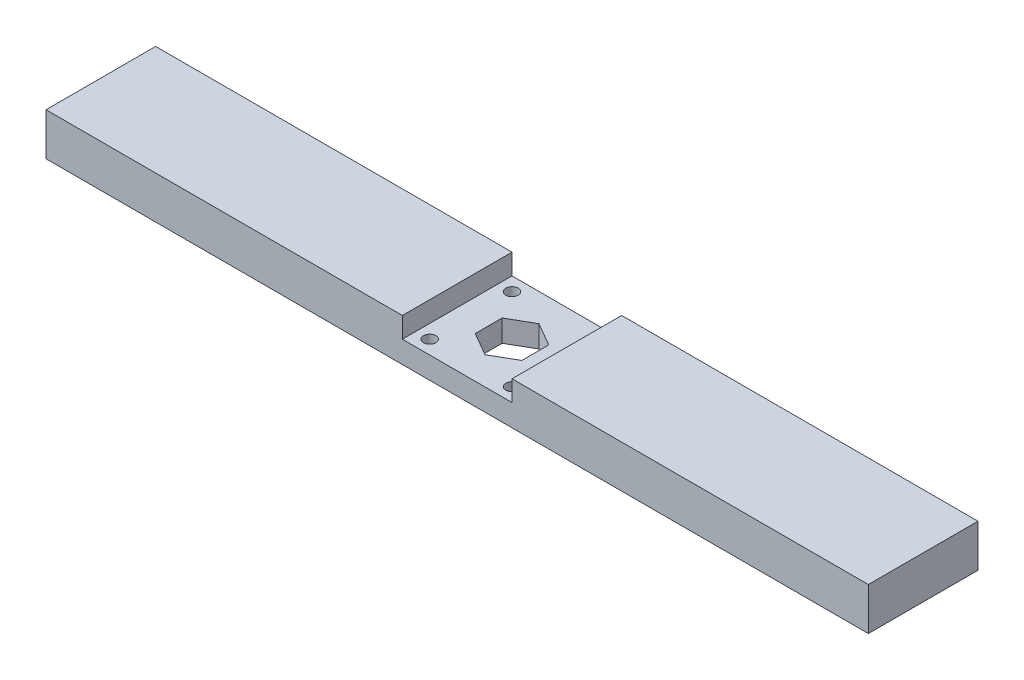
ISO-10303-21;
HEADER;
FILE_DESCRIPTION(('STEP AP214'),'2;1');
FILE_NAME('part.step','',(''),(''),'','','');
FILE_SCHEMA(('AUTOMOTIVE_DESIGN { 1 0 10303 214 1 1 1 1 }'));
ENDSEC;
DATA;
#1=APPLICATION_CONTEXT('core data for automotive mechanical design processes');
#2=APPLICATION_PROTOCOL_DEFINITION('international standard','automotive_design',2000,#1);
#3=PRODUCT_CONTEXT('',#1,'mechanical');
#4=PRODUCT('Part','Part','',(#3));
#5=PRODUCT_RELATED_PRODUCT_CATEGORY('part','',(#4));
#6=PRODUCT_DEFINITION_FORMATION('','',#4);
#7=PRODUCT_DEFINITION_CONTEXT('part definition',#1,'design');
#8=PRODUCT_DEFINITION('design','',#6,#7);
#9=PRODUCT_DEFINITION_SHAPE('','',#8);
#10=(LENGTH_UNIT() NAMED_UNIT(*) SI_UNIT(.MILLI.,.METRE.));
#11=(NAMED_UNIT(*) PLANE_ANGLE_UNIT() SI_UNIT($,.RADIAN.));
#12=(NAMED_UNIT(*) SI_UNIT($,.STERADIAN.) SOLID_ANGLE_UNIT());
#13=UNCERTAINTY_MEASURE_WITH_UNIT(LENGTH_MEASURE(1.E-05),#10,'distance_accuracy_value','');
#14=(GEOMETRIC_REPRESENTATION_CONTEXT(3) GLOBAL_UNCERTAINTY_ASSIGNED_CONTEXT((#13)) GLOBAL_UNIT_ASSIGNED_CONTEXT((#10,
#11,#12)) REPRESENTATION_CONTEXT('',''));
#15=CARTESIAN_POINT('',(0.,0.,0.));
#16=DIRECTION('',(0.,0.,1.));
#17=DIRECTION('',(1.,0.,0.));
#18=AXIS2_PLACEMENT_3D('',#15,#16,#17);
#19=CARTESIAN_POINT('',(-150.,7.75,20.));
#20=DIRECTION('',(0.,-1.,0.));
#21=DIRECTION('',(0.,0.,-1.));
#22=AXIS2_PLACEMENT_3D('',#19,#20,#21);
#23=PLANE('',#22);
#24=DIRECTION('',(-1.,0.,0.));
#25=VECTOR('',#24,1.);
#26=CARTESIAN_POINT('',(-150.,7.75,-20.));
#27=LINE('',#26,#25);
#28=CARTESIAN_POINT('',(-20.,7.75,-20.));
#29=VERTEX_POINT('',#28);
#30=CARTESIAN_POINT('',(-150.,7.75,-20.));
#31=VERTEX_POINT('',#30);
#32=EDGE_CURVE('E209',#29,#31,#27,.T.);
#33=ORIENTED_EDGE('',*,*,#32,.T.);
#34=DIRECTION('',(0.,0.,-1.));
#35=VECTOR('',#34,1.);
#36=CARTESIAN_POINT('',(-150.,7.75,20.));
#37=LINE('',#36,#35);
#38=CARTESIAN_POINT('',(-150.,7.75,20.));
#39=VERTEX_POINT('',#38);
#40=EDGE_CURVE('E11',#39,#31,#37,.T.);
#41=ORIENTED_EDGE('',*,*,#40,.F.);
#42=DIRECTION('',(-1.,0.,0.));
#43=VECTOR('',#42,1.);
#44=CARTESIAN_POINT('',(-150.,7.75,20.));
#45=LINE('',#44,#43);
#46=CARTESIAN_POINT('',(-20.,7.75,20.));
#47=VERTEX_POINT('',#46);
#48=EDGE_CURVE('E210',#47,#39,#45,.T.);
#49=ORIENTED_EDGE('',*,*,#48,.F.);
#50=DIRECTION('',(0.,0.,-1.));
#51=VECTOR('',#50,1.);
#52=CARTESIAN_POINT('',(-20.,7.75,20.));
#53=LINE('',#52,#51);
#54=EDGE_CURVE('E228',#47,#29,#53,.T.);
#55=ORIENTED_EDGE('',*,*,#54,.T.);
#56=EDGE_LOOP('',(#33,#41,#49,#55));
#57=FACE_BOUND('',#56,.T.);
#58=ADVANCED_FACE('F33',(#57),#23,.F.);
#59=CARTESIAN_POINT('',(-150.,7.75,20.));
#60=DIRECTION('',(1.,0.,0.));
#61=DIRECTION('',(0.,0.,-1.));
#62=AXIS2_PLACEMENT_3D('',#59,#60,#61);
#63=PLANE('',#62);
#64=DIRECTION('',(0.,-1.,0.));
#65=VECTOR('',#64,1.);
#66=CARTESIAN_POINT('',(-150.,7.75,-20.));
#67=LINE('',#66,#65);
#68=CARTESIAN_POINT('',(-150.,-7.75,-20.));
#69=VERTEX_POINT('',#68);
#70=EDGE_CURVE('E231',#31,#69,#67,.T.);
#71=ORIENTED_EDGE('',*,*,#70,.T.);
#72=DIRECTION('',(0.,0.,-1.));
#73=VECTOR('',#72,1.);
#74=CARTESIAN_POINT('',(-150.,-7.75,20.));
#75=LINE('',#74,#73);
#76=CARTESIAN_POINT('',(-150.,-7.75,20.));
#77=VERTEX_POINT('',#76);
#78=EDGE_CURVE('E40',#77,#69,#75,.T.);
#79=ORIENTED_EDGE('',*,*,#78,.F.);
#80=DIRECTION('',(0.,-1.,0.));
#81=VECTOR('',#80,1.);
#82=CARTESIAN_POINT('',(-150.,7.75,20.));
#83=LINE('',#82,#81);
#84=EDGE_CURVE('E213',#39,#77,#83,.T.);
#85=ORIENTED_EDGE('',*,*,#84,.F.);
#86=ORIENTED_EDGE('',*,*,#40,.T.);
#87=EDGE_LOOP('',(#71,#79,#85,#86));
#88=FACE_BOUND('',#87,.T.);
#89=ADVANCED_FACE('F288',(#88),#63,.F.);
#90=CARTESIAN_POINT('',(-150.,-7.75,20.));
#91=DIRECTION('',(0.,1.,0.));
#92=DIRECTION('',(-1.,0.,0.));
#93=AXIS2_PLACEMENT_3D('',#90,#91,#92);
#94=PLANE('',#93);
#95=CARTESIAN_POINT('',(-15.015,-7.75000000000001,-15.));
#96=DIRECTION('',(0.,1.,0.));
#97=DIRECTION('',(-1.,0.,0.));
#98=AXIS2_PLACEMENT_3D('',#95,#96,#97);
#99=CIRCLE('',#98,2.25);
#100=CARTESIAN_POINT('',(-17.265,-7.75000000000001,-15.));
#101=VERTEX_POINT('',#100);
#102=EDGE_CURVE('E206',#101,#101,#99,.T.);
#103=ORIENTED_EDGE('',*,*,#102,.T.);
#104=EDGE_LOOP('',(#103));
#105=FACE_BOUND('',#104,.T.);
#106=CARTESIAN_POINT('',(15.015,-7.75000000000002,15.));
#107=DIRECTION('',(0.,1.,0.));
#108=DIRECTION('',(-1.,0.,0.));
#109=AXIS2_PLACEMENT_3D('',#106,#107,#108);
#110=CIRCLE('',#109,2.25);
#111=CARTESIAN_POINT('',(12.765,-7.75000000000002,15.));
#112=VERTEX_POINT('',#111);
#113=EDGE_CURVE('E203',#112,#112,#110,.T.);
#114=ORIENTED_EDGE('',*,*,#113,.T.);
#115=EDGE_LOOP('',(#114));
#116=FACE_BOUND('',#115,.T.);
#117=CARTESIAN_POINT('',(-15.015,-7.75000000000001,15.));
#118=DIRECTION('',(0.,1.,0.));
#119=DIRECTION('',(-1.,0.,0.));
#120=AXIS2_PLACEMENT_3D('',#117,#118,#119);
#121=CIRCLE('',#120,2.25);
#122=CARTESIAN_POINT('',(-17.265,-7.75000000000001,15.));
#123=VERTEX_POINT('',#122);
#124=EDGE_CURVE('E200',#123,#123,#121,.T.);
#125=ORIENTED_EDGE('',*,*,#124,.T.);
#126=EDGE_LOOP('',(#125));
#127=FACE_BOUND('',#126,.T.);
#128=DIRECTION('',(0.,0.,1.));
#129=VECTOR('',#128,1.);
#130=CARTESIAN_POINT('',(-8.50000000000001,-7.75000000000002,20.));
#131=LINE('',#130,#129);
#132=CARTESIAN_POINT('',(-8.5,-7.75000000000001,-4.90747728811182));
#133=VERTEX_POINT('',#132);
#134=CARTESIAN_POINT('',(-8.5,-7.75000000000001,4.90747728811182));
#135=VERTEX_POINT('',#134);
#136=EDGE_CURVE('E194',#133,#135,#131,.T.);
#137=ORIENTED_EDGE('',*,*,#136,.T.);
#138=DIRECTION('',(0.866025403784439,0.,0.5));
#139=VECTOR('',#138,1.);
#140=CARTESIAN_POINT('',(-108.089745962156,-7.75000000000001,-52.5906893516652));
#141=LINE('',#140,#139);
#142=CARTESIAN_POINT('',(0.,-7.75000000000002,9.81495457622364));
#143=VERTEX_POINT('',#142);
#144=EDGE_CURVE('E197',#135,#143,#141,.T.);
#145=ORIENTED_EDGE('',*,*,#144,.T.);
#146=DIRECTION('',(0.866025403784438,0.,-0.500000000000001));
#147=VECTOR('',#146,1.);
#148=CARTESIAN_POINT('',(-116.910254037844,-7.75,77.3131212160007));
#149=LINE('',#148,#147);
#150=CARTESIAN_POINT('',(8.50000000000001,-7.75000000000002,4.90747728811182));
#151=VERTEX_POINT('',#150);
#152=EDGE_CURVE('E185',#143,#151,#149,.T.);
#153=ORIENTED_EDGE('',*,*,#152,.T.);
#154=DIRECTION('',(0.,0.,-1.));
#155=VECTOR('',#154,1.);
#156=CARTESIAN_POINT('',(8.50000000000001,-7.75000000000002,20.));
#157=LINE('',#156,#155);
#158=CARTESIAN_POINT('',(8.5,-7.75000000000002,-4.90747728811182));
#159=VERTEX_POINT('',#158);
#160=EDGE_CURVE('E139',#151,#159,#157,.T.);
#161=ORIENTED_EDGE('',*,*,#160,.T.);
#162=DIRECTION('',(-0.866025403784439,0.,-0.5));
#163=VECTOR('',#162,1.);
#164=CARTESIAN_POINT('',(-99.5897459621556,-7.75000000000001,-67.3131212160007));
#165=LINE('',#164,#163);
#166=CARTESIAN_POINT('',(0.,-7.75000000000002,-9.81495457622364));
#167=VERTEX_POINT('',#166);
#168=EDGE_CURVE('E188',#159,#167,#165,.T.);
#169=ORIENTED_EDGE('',*,*,#168,.T.);
#170=DIRECTION('',(-0.866025403784439,0.,0.5));
#171=VECTOR('',#170,1.);
#172=CARTESIAN_POINT('',(-125.410254037844,-7.75,62.5906893516652));
#173=LINE('',#172,#171);
#174=EDGE_CURVE('E191',#167,#133,#173,.T.);
#175=ORIENTED_EDGE('',*,*,#174,.T.);
#176=EDGE_LOOP('',(#137,#145,#153,#161,#169,#175));
#177=FACE_BOUND('',#176,.T.);
#178=CARTESIAN_POINT('',(15.015,-7.75000000000002,-15.));
#179=DIRECTION('',(0.,1.,0.));
#180=DIRECTION('',(-1.,0.,0.));
#181=AXIS2_PLACEMENT_3D('',#178,#179,#180);
#182=CIRCLE('',#181,2.25);
#183=CARTESIAN_POINT('',(12.765,-7.75000000000002,-15.));
#184=VERTEX_POINT('',#183);
#185=EDGE_CURVE('E182',#184,#184,#182,.T.);
#186=ORIENTED_EDGE('',*,*,#185,.T.);
#187=EDGE_LOOP('',(#186));
#188=FACE_BOUND('',#187,.T.);
#189=DIRECTION('',(1.,0.,0.));
#190=VECTOR('',#189,1.);
#191=CARTESIAN_POINT('',(-150.,-7.75,-20.));
#192=LINE('',#191,#190);
#193=CARTESIAN_POINT('',(150.,-7.75000000000004,-20.));
#194=VERTEX_POINT('',#193);
#195=EDGE_CURVE('E233',#69,#194,#192,.T.);
#196=ORIENTED_EDGE('',*,*,#195,.T.);
#197=DIRECTION('',(0.,0.,-1.));
#198=VECTOR('',#197,1.);
#199=CARTESIAN_POINT('',(150.,-7.75000000000004,20.));
#200=LINE('',#199,#198);
#201=CARTESIAN_POINT('',(150.,-7.75000000000004,20.));
#202=VERTEX_POINT('',#201);
#203=EDGE_CURVE('E258',#202,#194,#200,.T.);
#204=ORIENTED_EDGE('',*,*,#203,.F.);
#205=DIRECTION('',(1.,0.,0.));
#206=VECTOR('',#205,1.);
#207=CARTESIAN_POINT('',(-150.,-7.75,20.));
#208=LINE('',#207,#206);
#209=EDGE_CURVE('E216',#77,#202,#208,.T.);
#210=ORIENTED_EDGE('',*,*,#209,.F.);
#211=ORIENTED_EDGE('',*,*,#78,.T.);
#212=EDGE_LOOP('',(#196,#204,#210,#211));
#213=FACE_BOUND('',#212,.T.);
#214=ADVANCED_FACE('F265',(#105,#116,#127,#177,#188,#213),#94,.F.);
#215=CARTESIAN_POINT('',(150.,7.75000000000004,20.));
#216=DIRECTION('',(-1.,0.,0.));
#217=DIRECTION('',(0.,0.,1.));
#218=AXIS2_PLACEMENT_3D('',#215,#216,#217);
#219=PLANE('',#218);
#220=DIRECTION('',(0.,1.,0.));
#221=VECTOR('',#220,1.);
#222=CARTESIAN_POINT('',(150.,7.75000000000004,-20.));
#223=LINE('',#222,#221);
#224=CARTESIAN_POINT('',(150.,7.75000000000004,-20.));
#225=VERTEX_POINT('',#224);
#226=EDGE_CURVE('E235',#194,#225,#223,.T.);
#227=ORIENTED_EDGE('',*,*,#226,.T.);
#228=DIRECTION('',(0.,0.,-1.));
#229=VECTOR('',#228,1.);
#230=CARTESIAN_POINT('',(150.,7.75000000000004,20.));
#231=LINE('',#230,#229);
#232=CARTESIAN_POINT('',(150.,7.75000000000004,20.));
#233=VERTEX_POINT('',#232);
#234=EDGE_CURVE('E255',#233,#225,#231,.T.);
#235=ORIENTED_EDGE('',*,*,#234,.F.);
#236=DIRECTION('',(0.,1.,0.));
#237=VECTOR('',#236,1.);
#238=CARTESIAN_POINT('',(150.,7.75000000000004,20.));
#239=LINE('',#238,#237);
#240=EDGE_CURVE('E218',#202,#233,#239,.T.);
#241=ORIENTED_EDGE('',*,*,#240,.F.);
#242=ORIENTED_EDGE('',*,*,#203,.T.);
#243=EDGE_LOOP('',(#227,#235,#241,#242));
#244=FACE_BOUND('',#243,.T.);
#245=ADVANCED_FACE('F276',(#244),#219,.F.);
#246=CARTESIAN_POINT('',(150.,7.75000000000004,20.));
#247=DIRECTION('',(0.,-1.,0.));
#248=DIRECTION('',(1.,0.,0.));
#249=AXIS2_PLACEMENT_3D('',#246,#247,#248);
#250=PLANE('',#249);
#251=DIRECTION('',(-1.,0.,0.));
#252=VECTOR('',#251,1.);
#253=CARTESIAN_POINT('',(150.,7.75000000000004,-20.));
#254=LINE('',#253,#252);
#255=CARTESIAN_POINT('',(20.,7.75000000000001,-20.));
#256=VERTEX_POINT('',#255);
#257=EDGE_CURVE('E237',#225,#256,#254,.T.);
#258=ORIENTED_EDGE('',*,*,#257,.T.);
#259=DIRECTION('',(0.,0.,-1.));
#260=VECTOR('',#259,1.);
#261=CARTESIAN_POINT('',(20.,7.75000000000001,20.));
#262=LINE('',#261,#260);
#263=CARTESIAN_POINT('',(20.,7.75000000000001,20.));
#264=VERTEX_POINT('',#263);
#265=EDGE_CURVE('E252',#264,#256,#262,.T.);
#266=ORIENTED_EDGE('',*,*,#265,.F.);
#267=DIRECTION('',(-1.,0.,0.));
#268=VECTOR('',#267,1.);
#269=CARTESIAN_POINT('',(150.,7.75000000000004,20.));
#270=LINE('',#269,#268);
#271=EDGE_CURVE('E220',#233,#264,#270,.T.);
#272=ORIENTED_EDGE('',*,*,#271,.F.);
#273=ORIENTED_EDGE('',*,*,#234,.T.);
#274=EDGE_LOOP('',(#258,#266,#272,#273));
#275=FACE_BOUND('',#274,.T.);
#276=ADVANCED_FACE('F280',(#275),#250,.F.);
#277=CARTESIAN_POINT('',(20.,7.75000000000001,20.));
#278=DIRECTION('',(1.,0.,0.));
#279=DIRECTION('',(0.,1.,0.));
#280=AXIS2_PLACEMENT_3D('',#277,#278,#279);
#281=PLANE('',#280);
#282=DIRECTION('',(0.,-1.,0.));
#283=VECTOR('',#282,1.);
#284=CARTESIAN_POINT('',(20.,7.75000000000001,-20.));
#285=LINE('',#284,#283);
#286=CARTESIAN_POINT('',(20.,0.250000000000005,-20.));
#287=VERTEX_POINT('',#286);
#288=EDGE_CURVE('E239',#256,#287,#285,.T.);
#289=ORIENTED_EDGE('',*,*,#288,.T.);
#290=DIRECTION('',(0.,0.,-1.));
#291=VECTOR('',#290,1.);
#292=CARTESIAN_POINT('',(20.,0.250000000000005,20.));
#293=LINE('',#292,#291);
#294=CARTESIAN_POINT('',(20.,0.250000000000005,20.));
#295=VERTEX_POINT('',#294);
#296=EDGE_CURVE('E249',#295,#287,#293,.T.);
#297=ORIENTED_EDGE('',*,*,#296,.F.);
#298=DIRECTION('',(0.,-1.,0.));
#299=VECTOR('',#298,1.);
#300=CARTESIAN_POINT('',(20.,7.75000000000001,20.));
#301=LINE('',#300,#299);
#302=EDGE_CURVE('E222',#264,#295,#301,.T.);
#303=ORIENTED_EDGE('',*,*,#302,.F.);
#304=ORIENTED_EDGE('',*,*,#265,.T.);
#305=EDGE_LOOP('',(#289,#297,#303,#304));
#306=FACE_BOUND('',#305,.T.);
#307=ADVANCED_FACE('F300',(#306),#281,.F.);
#308=CARTESIAN_POINT('',(-20.,0.25,20.));
#309=DIRECTION('',(0.,-1.,0.));
#310=DIRECTION('',(1.,0.,0.));
#311=AXIS2_PLACEMENT_3D('',#308,#309,#310);
#312=PLANE('',#311);
#313=CARTESIAN_POINT('',(-15.015,0.250000000000003,-15.));
#314=DIRECTION('',(0.,1.,0.));
#315=DIRECTION('',(0.,0.,-1.));
#316=AXIS2_PLACEMENT_3D('',#313,#314,#315);
#317=CIRCLE('',#316,2.25);
#318=CARTESIAN_POINT('',(-15.015,0.250000000000003,-17.25));
#319=VERTEX_POINT('',#318);
#320=EDGE_CURVE('E173',#319,#319,#317,.T.);
#321=ORIENTED_EDGE('',*,*,#320,.F.);
#322=EDGE_LOOP('',(#321));
#323=FACE_BOUND('',#322,.T.);
#324=CARTESIAN_POINT('',(15.015,0.250000000000003,15.));
#325=DIRECTION('',(0.,1.,0.));
#326=DIRECTION('',(0.,0.,-1.));
#327=AXIS2_PLACEMENT_3D('',#324,#325,#326);
#328=CIRCLE('',#327,2.25);
#329=CARTESIAN_POINT('',(15.015,0.250000000000003,12.75));
#330=VERTEX_POINT('',#329);
#331=EDGE_CURVE('E177',#330,#330,#328,.T.);
#332=ORIENTED_EDGE('',*,*,#331,.F.);
#333=EDGE_LOOP('',(#332));
#334=FACE_BOUND('',#333,.T.);
#335=CARTESIAN_POINT('',(-15.015,0.250000000000003,15.));
#336=DIRECTION('',(0.,1.,0.));
#337=DIRECTION('',(0.,0.,1.));
#338=AXIS2_PLACEMENT_3D('',#335,#336,#337);
#339=CIRCLE('',#338,2.25);
#340=CARTESIAN_POINT('',(-15.015,0.250000000000003,17.25));
#341=VERTEX_POINT('',#340);
#342=EDGE_CURVE('E166',#341,#341,#339,.T.);
#343=ORIENTED_EDGE('',*,*,#342,.F.);
#344=EDGE_LOOP('',(#343));
#345=FACE_BOUND('',#344,.T.);
#346=DIRECTION('',(0.866025403784438,0.,-0.500000000000001));
#347=VECTOR('',#346,1.);
#348=CARTESIAN_POINT('',(0.,0.250000000000003,9.81495457622364));
#349=LINE('',#348,#347);
#350=CARTESIAN_POINT('',(0.,0.250000000000003,9.81495457622364));
#351=VERTEX_POINT('',#350);
#352=CARTESIAN_POINT('',(8.5,0.250000000000003,4.90747728811181));
#353=VERTEX_POINT('',#352);
#354=EDGE_CURVE('E145',#351,#353,#349,.T.);
#355=ORIENTED_EDGE('',*,*,#354,.F.);
#356=DIRECTION('',(0.866025403784439,0.,0.5));
#357=VECTOR('',#356,1.);
#358=CARTESIAN_POINT('',(-8.5,0.250000000000003,4.90747728811182));
#359=LINE('',#358,#357);
#360=CARTESIAN_POINT('',(-8.5,0.250000000000003,4.90747728811182));
#361=VERTEX_POINT('',#360);
#362=EDGE_CURVE('E55',#361,#351,#359,.T.);
#363=ORIENTED_EDGE('',*,*,#362,.F.);
#364=DIRECTION('',(0.,0.,1.));
#365=VECTOR('',#364,1.);
#366=CARTESIAN_POINT('',(-8.5,0.250000000000003,-4.90747728811182));
#367=LINE('',#366,#365);
#368=CARTESIAN_POINT('',(-8.5,0.250000000000003,-4.90747728811182));
#369=VERTEX_POINT('',#368);
#370=EDGE_CURVE('E161',#369,#361,#367,.T.);
#371=ORIENTED_EDGE('',*,*,#370,.F.);
#372=DIRECTION('',(-0.866025403784439,0.,0.5));
#373=VECTOR('',#372,1.);
#374=CARTESIAN_POINT('',(0.,0.250000000000003,-9.81495457622364));
#375=LINE('',#374,#373);
#376=CARTESIAN_POINT('',(0.,0.250000000000003,-9.81495457622364));
#377=VERTEX_POINT('',#376);
#378=EDGE_CURVE('E155',#377,#369,#375,.T.);
#379=ORIENTED_EDGE('',*,*,#378,.F.);
#380=DIRECTION('',(-0.866025403784438,0.,-0.5));
#381=VECTOR('',#380,1.);
#382=CARTESIAN_POINT('',(8.5,0.250000000000003,-4.90747728811182));
#383=LINE('',#382,#381);
#384=CARTESIAN_POINT('',(8.5,0.250000000000003,-4.90747728811182));
#385=VERTEX_POINT('',#384);
#386=EDGE_CURVE('E153',#385,#377,#383,.T.);
#387=ORIENTED_EDGE('',*,*,#386,.F.);
#388=DIRECTION('',(0.,0.,-1.));
#389=VECTOR('',#388,1.);
#390=CARTESIAN_POINT('',(8.5,0.250000000000003,4.90747728811181));
#391=LINE('',#390,#389);
#392=EDGE_CURVE('E136',#353,#385,#391,.T.);
#393=ORIENTED_EDGE('',*,*,#392,.F.);
#394=EDGE_LOOP('',(#355,#363,#371,#379,#387,#393));
#395=FACE_BOUND('',#394,.T.);
#396=CARTESIAN_POINT('',(15.015,0.250000000000003,-15.));
#397=DIRECTION('',(0.,1.,0.));
#398=DIRECTION('',(0.,0.,1.));
#399=AXIS2_PLACEMENT_3D('',#396,#397,#398);
#400=CIRCLE('',#399,2.25);
#401=CARTESIAN_POINT('',(15.015,0.250000000000003,-12.75));
#402=VERTEX_POINT('',#401);
#403=EDGE_CURVE('E176',#402,#402,#400,.T.);
#404=ORIENTED_EDGE('',*,*,#403,.F.);
#405=EDGE_LOOP('',(#404));
#406=FACE_BOUND('',#405,.T.);
#407=DIRECTION('',(-1.,0.,0.));
#408=VECTOR('',#407,1.);
#409=CARTESIAN_POINT('',(-20.,0.25,-20.));
#410=LINE('',#409,#408);
#411=CARTESIAN_POINT('',(-20.,0.25,-20.));
#412=VERTEX_POINT('',#411);
#413=EDGE_CURVE('E241',#287,#412,#410,.T.);
#414=ORIENTED_EDGE('',*,*,#413,.T.);
#415=DIRECTION('',(0.,0.,-1.));
#416=VECTOR('',#415,1.);
#417=CARTESIAN_POINT('',(-20.,0.25,20.));
#418=LINE('',#417,#416);
#419=CARTESIAN_POINT('',(-20.,0.25,20.));
#420=VERTEX_POINT('',#419);
#421=EDGE_CURVE('E246',#420,#412,#418,.T.);
#422=ORIENTED_EDGE('',*,*,#421,.F.);
#423=DIRECTION('',(-1.,0.,0.));
#424=VECTOR('',#423,1.);
#425=CARTESIAN_POINT('',(-20.,0.25,20.));
#426=LINE('',#425,#424);
#427=EDGE_CURVE('E224',#295,#420,#426,.T.);
#428=ORIENTED_EDGE('',*,*,#427,.F.);
#429=ORIENTED_EDGE('',*,*,#296,.T.);
#430=EDGE_LOOP('',(#414,#422,#428,#429));
#431=FACE_BOUND('',#430,.T.);
#432=ADVANCED_FACE('F149',(#323,#334,#345,#395,#406,#431),#312,.F.);
#433=CARTESIAN_POINT('',(-20.,7.75,20.));
#434=DIRECTION('',(-1.,0.,0.));
#435=DIRECTION('',(0.,-1.,0.));
#436=AXIS2_PLACEMENT_3D('',#433,#434,#435);
#437=PLANE('',#436);
#438=DIRECTION('',(0.,1.,0.));
#439=VECTOR('',#438,1.);
#440=CARTESIAN_POINT('',(-20.,7.75,-20.));
#441=LINE('',#440,#439);
#442=EDGE_CURVE('E214',#412,#29,#441,.T.);
#443=ORIENTED_EDGE('',*,*,#442,.T.);
#444=ORIENTED_EDGE('',*,*,#54,.F.);
#445=DIRECTION('',(0.,1.,0.));
#446=VECTOR('',#445,1.);
#447=CARTESIAN_POINT('',(-20.,7.75,20.));
#448=LINE('',#447,#446);
#449=EDGE_CURVE('E226',#420,#47,#448,.T.);
#450=ORIENTED_EDGE('',*,*,#449,.F.);
#451=ORIENTED_EDGE('',*,*,#421,.T.);
#452=EDGE_LOOP('',(#443,#444,#450,#451));
#453=FACE_BOUND('',#452,.T.);
#454=ADVANCED_FACE('F294',(#453),#437,.F.);
#455=CARTESIAN_POINT('',(0.,0.,20.));
#456=DIRECTION('',(0.,0.,-1.));
#457=DIRECTION('',(-1.,0.,0.));
#458=AXIS2_PLACEMENT_3D('',#455,#456,#457);
#459=PLANE('',#458);
#460=ORIENTED_EDGE('',*,*,#48,.T.);
#461=ORIENTED_EDGE('',*,*,#84,.T.);
#462=ORIENTED_EDGE('',*,*,#209,.T.);
#463=ORIENTED_EDGE('',*,*,#240,.T.);
#464=ORIENTED_EDGE('',*,*,#271,.T.);
#465=ORIENTED_EDGE('',*,*,#302,.T.);
#466=ORIENTED_EDGE('',*,*,#427,.T.);
#467=ORIENTED_EDGE('',*,*,#449,.T.);
#468=EDGE_LOOP('',(#460,#461,#462,#463,#464,#465,#466,#467));
#469=FACE_BOUND('',#468,.T.);
#470=ADVANCED_FACE('F284',(#469),#459,.F.);
#471=CARTESIAN_POINT('',(0.,0.,-20.));
#472=DIRECTION('',(0.,0.,-1.));
#473=DIRECTION('',(-1.,0.,0.));
#474=AXIS2_PLACEMENT_3D('',#471,#472,#473);
#475=PLANE('',#474);
#476=ORIENTED_EDGE('',*,*,#32,.F.);
#477=ORIENTED_EDGE('',*,*,#442,.F.);
#478=ORIENTED_EDGE('',*,*,#413,.F.);
#479=ORIENTED_EDGE('',*,*,#288,.F.);
#480=ORIENTED_EDGE('',*,*,#257,.F.);
#481=ORIENTED_EDGE('',*,*,#226,.F.);
#482=ORIENTED_EDGE('',*,*,#195,.F.);
#483=ORIENTED_EDGE('',*,*,#70,.F.);
#484=EDGE_LOOP('',(#476,#477,#478,#479,#480,#481,#482,#483));
#485=FACE_BOUND('',#484,.T.);
#486=ADVANCED_FACE('F271',(#485),#475,.T.);
#487=CARTESIAN_POINT('',(15.015,-39.75,-15.));
#488=DIRECTION('',(0.,1.,0.));
#489=DIRECTION('',(0.,0.,1.));
#490=AXIS2_PLACEMENT_3D('',#487,#488,#489);
#491=CYLINDRICAL_SURFACE('',#490,2.25);
#492=ORIENTED_EDGE('',*,*,#403,.T.);
#493=EDGE_LOOP('',(#492));
#494=FACE_BOUND('',#493,.T.);
#495=ORIENTED_EDGE('',*,*,#185,.F.);
#496=EDGE_LOOP('',(#495));
#497=FACE_BOUND('',#496,.T.);
#498=ADVANCED_FACE('F358',(#494,#497),#491,.F.);
#499=CARTESIAN_POINT('',(-8.5,-39.75,4.90747728811182));
#500=DIRECTION('',(-0.5,0.,0.866025403784438));
#501=DIRECTION('',(0.866025403784439,0.,0.5));
#502=AXIS2_PLACEMENT_3D('',#499,#500,#501);
#503=PLANE('',#502);
#504=DIRECTION('',(0.,1.,0.));
#505=VECTOR('',#504,1.);
#506=CARTESIAN_POINT('',(-8.5,-39.75,4.90747728811182));
#507=LINE('',#506,#505);
#508=EDGE_CURVE('E164',#135,#361,#507,.T.);
#509=ORIENTED_EDGE('',*,*,#508,.T.);
#510=ORIENTED_EDGE('',*,*,#362,.T.);
#511=DIRECTION('',(0.,1.,0.));
#512=VECTOR('',#511,1.);
#513=CARTESIAN_POINT('',(0.,-39.75,9.81495457622364));
#514=LINE('',#513,#512);
#515=EDGE_CURVE('E142',#143,#351,#514,.T.);
#516=ORIENTED_EDGE('',*,*,#515,.F.);
#517=ORIENTED_EDGE('',*,*,#144,.F.);
#518=EDGE_LOOP('',(#509,#510,#516,#517));
#519=FACE_BOUND('',#518,.T.);
#520=ADVANCED_FACE('F378',(#519),#503,.F.);
#521=CARTESIAN_POINT('',(-8.5,-39.75,-4.90747728811182));
#522=DIRECTION('',(-1.,0.,0.));
#523=DIRECTION('',(0.,0.,1.));
#524=AXIS2_PLACEMENT_3D('',#521,#522,#523);
#525=PLANE('',#524);
#526=DIRECTION('',(0.,1.,0.));
#527=VECTOR('',#526,1.);
#528=CARTESIAN_POINT('',(-8.5,-39.75,-4.90747728811182));
#529=LINE('',#528,#527);
#530=EDGE_CURVE('E167',#133,#369,#529,.T.);
#531=ORIENTED_EDGE('',*,*,#530,.T.);
#532=ORIENTED_EDGE('',*,*,#370,.T.);
#533=ORIENTED_EDGE('',*,*,#508,.F.);
#534=ORIENTED_EDGE('',*,*,#136,.F.);
#535=EDGE_LOOP('',(#531,#532,#533,#534));
#536=FACE_BOUND('',#535,.T.);
#537=ADVANCED_FACE('F388',(#536),#525,.F.);
#538=CARTESIAN_POINT('',(0.,-39.75,-9.81495457622364));
#539=DIRECTION('',(-0.5,0.,-0.866025403784439));
#540=DIRECTION('',(-0.866025403784439,0.,0.5));
#541=AXIS2_PLACEMENT_3D('',#538,#539,#540);
#542=PLANE('',#541);
#543=DIRECTION('',(0.,1.,0.));
#544=VECTOR('',#543,1.);
#545=CARTESIAN_POINT('',(0.,-39.75,-9.81495457622364));
#546=LINE('',#545,#544);
#547=EDGE_CURVE('E169',#167,#377,#546,.T.);
#548=ORIENTED_EDGE('',*,*,#547,.T.);
#549=ORIENTED_EDGE('',*,*,#378,.T.);
#550=ORIENTED_EDGE('',*,*,#530,.F.);
#551=ORIENTED_EDGE('',*,*,#174,.F.);
#552=EDGE_LOOP('',(#548,#549,#550,#551));
#553=FACE_BOUND('',#552,.T.);
#554=ADVANCED_FACE('F397',(#553),#542,.F.);
#555=CARTESIAN_POINT('',(8.5,-39.75,-4.90747728811182));
#556=DIRECTION('',(0.5,0.,-0.866025403784439));
#557=DIRECTION('',(-0.866025403784439,0.,-0.5));
#558=AXIS2_PLACEMENT_3D('',#555,#556,#557);
#559=PLANE('',#558);
#560=DIRECTION('',(0.,1.,0.));
#561=VECTOR('',#560,1.);
#562=CARTESIAN_POINT('',(8.5,-39.75,-4.90747728811182));
#563=LINE('',#562,#561);
#564=EDGE_CURVE('E141',#159,#385,#563,.T.);
#565=ORIENTED_EDGE('',*,*,#564,.T.);
#566=ORIENTED_EDGE('',*,*,#386,.T.);
#567=ORIENTED_EDGE('',*,*,#547,.F.);
#568=ORIENTED_EDGE('',*,*,#168,.F.);
#569=EDGE_LOOP('',(#565,#566,#567,#568));
#570=FACE_BOUND('',#569,.T.);
#571=ADVANCED_FACE('F407',(#570),#559,.F.);
#572=CARTESIAN_POINT('',(8.5,-39.75,4.90747728811181));
#573=DIRECTION('',(1.,0.,0.));
#574=DIRECTION('',(0.,0.,-1.));
#575=AXIS2_PLACEMENT_3D('',#572,#573,#574);
#576=PLANE('',#575);
#577=DIRECTION('',(0.,1.,0.));
#578=VECTOR('',#577,1.);
#579=CARTESIAN_POINT('',(8.5,-39.75,4.90747728811181));
#580=LINE('',#579,#578);
#581=EDGE_CURVE('E47',#151,#353,#580,.T.);
#582=ORIENTED_EDGE('',*,*,#581,.T.);
#583=ORIENTED_EDGE('',*,*,#392,.T.);
#584=ORIENTED_EDGE('',*,*,#564,.F.);
#585=ORIENTED_EDGE('',*,*,#160,.F.);
#586=EDGE_LOOP('',(#582,#583,#584,#585));
#587=FACE_BOUND('',#586,.T.);
#588=ADVANCED_FACE('F133',(#587),#576,.F.);
#589=CARTESIAN_POINT('',(0.,-39.75,9.81495457622364));
#590=DIRECTION('',(0.500000000000001,0.,0.866025403784438));
#591=DIRECTION('',(0.866025403784438,0.,-0.500000000000001));
#592=AXIS2_PLACEMENT_3D('',#589,#590,#591);
#593=PLANE('',#592);
#594=ORIENTED_EDGE('',*,*,#515,.T.);
#595=ORIENTED_EDGE('',*,*,#354,.T.);
#596=ORIENTED_EDGE('',*,*,#581,.F.);
#597=ORIENTED_EDGE('',*,*,#152,.F.);
#598=EDGE_LOOP('',(#594,#595,#596,#597));
#599=FACE_BOUND('',#598,.T.);
#600=ADVANCED_FACE('F146',(#599),#593,.F.);
#601=CARTESIAN_POINT('',(-15.015,-39.75,15.));
#602=DIRECTION('',(0.,1.,0.));
#603=DIRECTION('',(0.,0.,1.));
#604=AXIS2_PLACEMENT_3D('',#601,#602,#603);
#605=CYLINDRICAL_SURFACE('',#604,2.25);
#606=ORIENTED_EDGE('',*,*,#342,.T.);
#607=EDGE_LOOP('',(#606));
#608=FACE_BOUND('',#607,.T.);
#609=ORIENTED_EDGE('',*,*,#124,.F.);
#610=EDGE_LOOP('',(#609));
#611=FACE_BOUND('',#610,.T.);
#612=ADVANCED_FACE('F434',(#608,#611),#605,.F.);
#613=CARTESIAN_POINT('',(15.015,-39.75,15.));
#614=DIRECTION('',(0.,1.,0.));
#615=DIRECTION('',(0.,0.,1.));
#616=AXIS2_PLACEMENT_3D('',#613,#614,#615);
#617=CYLINDRICAL_SURFACE('',#616,2.25);
#618=ORIENTED_EDGE('',*,*,#331,.T.);
#619=EDGE_LOOP('',(#618));
#620=FACE_BOUND('',#619,.T.);
#621=ORIENTED_EDGE('',*,*,#113,.F.);
#622=EDGE_LOOP('',(#621));
#623=FACE_BOUND('',#622,.T.);
#624=ADVANCED_FACE('F443',(#620,#623),#617,.F.);
#625=CARTESIAN_POINT('',(-15.015,-39.75,-15.));
#626=DIRECTION('',(0.,1.,0.));
#627=DIRECTION('',(0.,0.,1.));
#628=AXIS2_PLACEMENT_3D('',#625,#626,#627);
#629=CYLINDRICAL_SURFACE('',#628,2.25);
#630=ORIENTED_EDGE('',*,*,#320,.T.);
#631=EDGE_LOOP('',(#630));
#632=FACE_BOUND('',#631,.T.);
#633=ORIENTED_EDGE('',*,*,#102,.F.);
#634=EDGE_LOOP('',(#633));
#635=FACE_BOUND('',#634,.T.);
#636=ADVANCED_FACE('F453',(#632,#635),#629,.F.);
#637=CLOSED_SHELL('',(#58,#89,#214,#245,#276,#307,#432,#454,#470,#486,#498,#520,#537,#554,#571,
#588,#600,#612,#624,#636));
#638=MANIFOLD_SOLID_BREP('B2',#637);
#639=ADVANCED_BREP_SHAPE_REPRESENTATION('',(#18,#638),#14);
#640=SHAPE_DEFINITION_REPRESENTATION(#9,#639);
ENDSEC;
END-ISO-10303-21;
